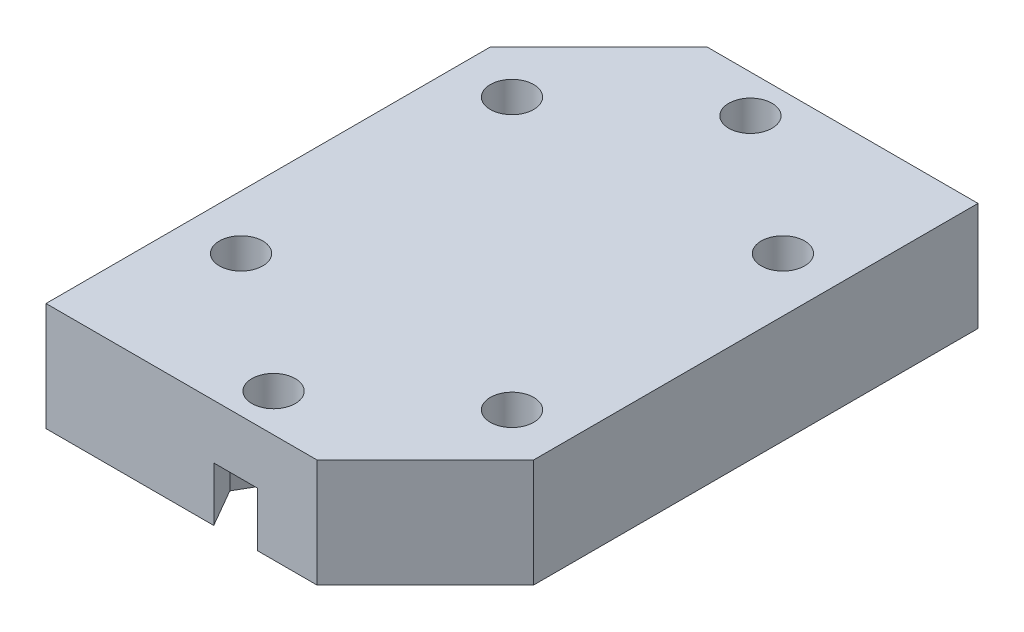
ISO-10303-21;
HEADER;
FILE_DESCRIPTION(('STEP AP214'),'2;1');
FILE_NAME('part.step','',(''),(''),'','','');
FILE_SCHEMA(('AUTOMOTIVE_DESIGN { 1 0 10303 214 1 1 1 1 }'));
ENDSEC;
DATA;
#1=APPLICATION_CONTEXT('core data for automotive mechanical design processes');
#2=APPLICATION_PROTOCOL_DEFINITION('international standard','automotive_design',2000,#1);
#3=PRODUCT_CONTEXT('',#1,'mechanical');
#4=PRODUCT('Part','Part','',(#3));
#5=PRODUCT_RELATED_PRODUCT_CATEGORY('part','',(#4));
#6=PRODUCT_DEFINITION_FORMATION('','',#4);
#7=PRODUCT_DEFINITION_CONTEXT('part definition',#1,'design');
#8=PRODUCT_DEFINITION('design','',#6,#7);
#9=PRODUCT_DEFINITION_SHAPE('','',#8);
#10=(LENGTH_UNIT() NAMED_UNIT(*) SI_UNIT(.MILLI.,.METRE.));
#11=(NAMED_UNIT(*) PLANE_ANGLE_UNIT() SI_UNIT($,.RADIAN.));
#12=(NAMED_UNIT(*) SI_UNIT($,.STERADIAN.) SOLID_ANGLE_UNIT());
#13=UNCERTAINTY_MEASURE_WITH_UNIT(LENGTH_MEASURE(1.E-05),#10,'distance_accuracy_value','');
#14=(GEOMETRIC_REPRESENTATION_CONTEXT(3) GLOBAL_UNCERTAINTY_ASSIGNED_CONTEXT((#13)) GLOBAL_UNIT_ASSIGNED_CONTEXT((#10,
#11,#12)) REPRESENTATION_CONTEXT('',''));
#15=CARTESIAN_POINT('',(0.,0.,0.));
#16=DIRECTION('',(0.,0.,1.));
#17=DIRECTION('',(1.,0.,0.));
#18=AXIS2_PLACEMENT_3D('',#15,#16,#17);
#19=CARTESIAN_POINT('',(0.,0.,0.));
#20=DIRECTION('',(0.,1.,0.));
#21=DIRECTION('',(0.,0.,1.));
#22=AXIS2_PLACEMENT_3D('',#19,#20,#21);
#23=PLANE('',#22);
#24=CARTESIAN_POINT('',(-12.5,0.,12.5));
#25=DIRECTION('',(0.,1.,0.));
#26=DIRECTION('',(0.,0.,-1.));
#27=AXIS2_PLACEMENT_3D('',#24,#25,#26);
#28=CIRCLE('',#27,2.);
#29=CARTESIAN_POINT('',(-12.5,0.,10.5));
#30=VERTEX_POINT('',#29);
#31=EDGE_CURVE('E219',#30,#30,#28,.T.);
#32=ORIENTED_EDGE('',*,*,#31,.T.);
#33=EDGE_LOOP('',(#32));
#34=FACE_BOUND('',#33,.T.);
#35=CARTESIAN_POINT('',(12.5,0.,-12.5));
#36=DIRECTION('',(0.,1.,0.));
#37=DIRECTION('',(0.,0.,-1.));
#38=AXIS2_PLACEMENT_3D('',#35,#36,#37);
#39=CIRCLE('',#38,2.);
#40=CARTESIAN_POINT('',(12.5,0.,-14.5));
#41=VERTEX_POINT('',#40);
#42=EDGE_CURVE('E229',#41,#41,#39,.T.);
#43=ORIENTED_EDGE('',*,*,#42,.T.);
#44=EDGE_LOOP('',(#43));
#45=FACE_BOUND('',#44,.T.);
#46=CARTESIAN_POINT('',(-12.5,0.,-12.5));
#47=DIRECTION('',(0.,1.,0.));
#48=DIRECTION('',(0.,0.,1.));
#49=AXIS2_PLACEMENT_3D('',#46,#47,#48);
#50=CIRCLE('',#49,2.);
#51=CARTESIAN_POINT('',(-12.5,0.,-10.5));
#52=VERTEX_POINT('',#51);
#53=EDGE_CURVE('E235',#52,#52,#50,.T.);
#54=ORIENTED_EDGE('',*,*,#53,.T.);
#55=EDGE_LOOP('',(#54));
#56=FACE_BOUND('',#55,.T.);
#57=CARTESIAN_POINT('',(12.5,0.,12.5));
#58=DIRECTION('',(0.,1.,0.));
#59=DIRECTION('',(0.,0.,1.));
#60=AXIS2_PLACEMENT_3D('',#57,#58,#59);
#61=CIRCLE('',#60,2.00000000000002);
#62=CARTESIAN_POINT('',(12.5,0.,14.5));
#63=VERTEX_POINT('',#62);
#64=EDGE_CURVE('E223',#63,#63,#61,.T.);
#65=ORIENTED_EDGE('',*,*,#64,.T.);
#66=EDGE_LOOP('',(#65));
#67=FACE_BOUND('',#66,.T.);
#68=DIRECTION('',(0.,0.,1.));
#69=VECTOR('',#68,1.);
#70=CARTESIAN_POINT('',(-17.5,0.,-25.5));
#71=LINE('',#70,#69);
#72=CARTESIAN_POINT('',(-17.5,0.,-15.5));
#73=VERTEX_POINT('',#72);
#74=CARTESIAN_POINT('',(-17.5,0.,25.5));
#75=VERTEX_POINT('',#74);
#76=EDGE_CURVE('E174',#73,#75,#71,.T.);
#77=ORIENTED_EDGE('',*,*,#76,.F.);
#78=DIRECTION('',(-0.707106781186548,0.,0.707106781186548));
#79=VECTOR('',#78,1.);
#80=CARTESIAN_POINT('',(-7.5,0.,-25.5));
#81=LINE('',#80,#79);
#82=CARTESIAN_POINT('',(-7.5,0.,-25.5));
#83=VERTEX_POINT('',#82);
#84=EDGE_CURVE('E50',#83,#73,#81,.T.);
#85=ORIENTED_EDGE('',*,*,#84,.F.);
#86=DIRECTION('',(-1.,0.,0.));
#87=VECTOR('',#86,1.);
#88=CARTESIAN_POINT('',(-17.5,0.,-25.5));
#89=LINE('',#88,#87);
#90=CARTESIAN_POINT('',(-2.02072594216369,0.,-25.5));
#91=VERTEX_POINT('',#90);
#92=EDGE_CURVE('E172',#91,#83,#89,.T.);
#93=ORIENTED_EDGE('',*,*,#92,.F.);
#94=DIRECTION('',(-0.5,0.,0.866025403784439));
#95=VECTOR('',#94,1.);
#96=CARTESIAN_POINT('',(-2.02072594216369,0.,-25.5));
#97=LINE('',#96,#95);
#98=CARTESIAN_POINT('',(-4.04145188432738,0.,-22.));
#99=VERTEX_POINT('',#98);
#100=EDGE_CURVE('E330',#91,#99,#97,.T.);
#101=ORIENTED_EDGE('',*,*,#100,.T.);
#102=DIRECTION('',(0.5,0.,0.866025403784439));
#103=VECTOR('',#102,1.);
#104=CARTESIAN_POINT('',(-4.04145188432738,0.,-22.));
#105=LINE('',#104,#103);
#106=CARTESIAN_POINT('',(-2.02072594216369,0.,-18.5));
#107=VERTEX_POINT('',#106);
#108=EDGE_CURVE('E332',#99,#107,#105,.T.);
#109=ORIENTED_EDGE('',*,*,#108,.T.);
#110=DIRECTION('',(1.,0.,0.));
#111=VECTOR('',#110,1.);
#112=CARTESIAN_POINT('',(-2.02072594216369,0.,-18.5));
#113=LINE('',#112,#111);
#114=CARTESIAN_POINT('',(2.02072594216369,0.,-18.5));
#115=VERTEX_POINT('',#114);
#116=EDGE_CURVE('E314',#107,#115,#113,.T.);
#117=ORIENTED_EDGE('',*,*,#116,.T.);
#118=DIRECTION('',(0.5,0.,-0.866025403784439));
#119=VECTOR('',#118,1.);
#120=CARTESIAN_POINT('',(2.02072594216369,0.,-18.5));
#121=LINE('',#120,#119);
#122=CARTESIAN_POINT('',(4.04145188432738,0.,-22.));
#123=VERTEX_POINT('',#122);
#124=EDGE_CURVE('E325',#115,#123,#121,.T.);
#125=ORIENTED_EDGE('',*,*,#124,.T.);
#126=DIRECTION('',(-0.5,0.,-0.866025403784439));
#127=VECTOR('',#126,1.);
#128=CARTESIAN_POINT('',(4.04145188432738,0.,-22.));
#129=LINE('',#128,#127);
#130=CARTESIAN_POINT('',(2.02072594216369,0.,-25.5));
#131=VERTEX_POINT('',#130);
#132=EDGE_CURVE('E327',#123,#131,#129,.T.);
#133=ORIENTED_EDGE('',*,*,#132,.T.);
#134=CARTESIAN_POINT('',(17.5,0.,-25.5));
#135=VERTEX_POINT('',#134);
#136=EDGE_CURVE('E181',#135,#131,#89,.T.);
#137=ORIENTED_EDGE('',*,*,#136,.F.);
#138=DIRECTION('',(0.,0.,-1.));
#139=VECTOR('',#138,1.);
#140=CARTESIAN_POINT('',(17.5,0.,-25.5));
#141=LINE('',#140,#139);
#142=CARTESIAN_POINT('',(17.5,0.,15.5));
#143=VERTEX_POINT('',#142);
#144=EDGE_CURVE('E182',#143,#135,#141,.T.);
#145=ORIENTED_EDGE('',*,*,#144,.F.);
#146=DIRECTION('',(-0.707106781186548,0.,0.707106781186548));
#147=VECTOR('',#146,1.);
#148=CARTESIAN_POINT('',(17.5,0.,15.5));
#149=LINE('',#148,#147);
#150=CARTESIAN_POINT('',(7.50000000000001,0.,25.5));
#151=VERTEX_POINT('',#150);
#152=EDGE_CURVE('E58',#143,#151,#149,.T.);
#153=ORIENTED_EDGE('',*,*,#152,.T.);
#154=DIRECTION('',(1.,0.,0.));
#155=VECTOR('',#154,1.);
#156=CARTESIAN_POINT('',(-17.5,0.,25.5));
#157=LINE('',#156,#155);
#158=CARTESIAN_POINT('',(2.02072594216373,0.,25.5));
#159=VERTEX_POINT('',#158);
#160=EDGE_CURVE('E190',#159,#151,#157,.T.);
#161=ORIENTED_EDGE('',*,*,#160,.F.);
#162=DIRECTION('',(0.499999999999995,0.,-0.866025403784441));
#163=VECTOR('',#162,1.);
#164=CARTESIAN_POINT('',(2.02072594216373,0.,25.5));
#165=LINE('',#164,#163);
#166=CARTESIAN_POINT('',(4.04145188432738,0.,22.));
#167=VERTEX_POINT('',#166);
#168=EDGE_CURVE('E265',#159,#167,#165,.T.);
#169=ORIENTED_EDGE('',*,*,#168,.T.);
#170=DIRECTION('',(-0.500000000000001,0.,-0.866025403784438));
#171=VECTOR('',#170,1.);
#172=CARTESIAN_POINT('',(4.04145188432738,0.,22.));
#173=LINE('',#172,#171);
#174=CARTESIAN_POINT('',(2.02072594216368,0.,18.5));
#175=VERTEX_POINT('',#174);
#176=EDGE_CURVE('E288',#167,#175,#173,.T.);
#177=ORIENTED_EDGE('',*,*,#176,.T.);
#178=DIRECTION('',(-1.,0.,0.));
#179=VECTOR('',#178,1.);
#180=CARTESIAN_POINT('',(2.02072594216368,0.,18.5));
#181=LINE('',#180,#179);
#182=CARTESIAN_POINT('',(-2.02072594216371,0.,18.5));
#183=VERTEX_POINT('',#182);
#184=EDGE_CURVE('E291',#175,#183,#181,.T.);
#185=ORIENTED_EDGE('',*,*,#184,.T.);
#186=DIRECTION('',(-0.499999999999995,0.,0.866025403784441));
#187=VECTOR('',#186,1.);
#188=CARTESIAN_POINT('',(-2.02072594216371,0.,18.5));
#189=LINE('',#188,#187);
#190=CARTESIAN_POINT('',(-4.04145188432738,0.,22.));
#191=VERTEX_POINT('',#190);
#192=EDGE_CURVE('E294',#183,#191,#189,.T.);
#193=ORIENTED_EDGE('',*,*,#192,.T.);
#194=DIRECTION('',(0.500000000000007,0.,0.866025403784434));
#195=VECTOR('',#194,1.);
#196=CARTESIAN_POINT('',(-4.04145188432738,0.,22.));
#197=LINE('',#196,#195);
#198=CARTESIAN_POINT('',(-2.02072594216366,0.,25.5));
#199=VERTEX_POINT('',#198);
#200=EDGE_CURVE('E274',#191,#199,#197,.T.);
#201=ORIENTED_EDGE('',*,*,#200,.T.);
#202=EDGE_CURVE('E191',#75,#199,#157,.T.);
#203=ORIENTED_EDGE('',*,*,#202,.F.);
#204=EDGE_LOOP('',(#77,#85,#93,#101,#109,#117,#125,#133,#137,#145,#153,#161,#169,#177,#185,#193,
#201,#203));
#205=FACE_BOUND('',#204,.T.);
#206=ADVANCED_FACE('F33',(#34,#45,#56,#67,#205),#23,.F.);
#207=CARTESIAN_POINT('',(-17.5,10.,25.5));
#208=DIRECTION('',(0.,0.,-1.));
#209=DIRECTION('',(-1.,0.,0.));
#210=AXIS2_PLACEMENT_3D('',#207,#208,#209);
#211=PLANE('',#210);
#212=DIRECTION('',(0.,-1.,0.));
#213=VECTOR('',#212,1.);
#214=CARTESIAN_POINT('',(7.50000000000001,10.,25.5));
#215=LINE('',#214,#213);
#216=CARTESIAN_POINT('',(7.50000000000001,10.,25.5));
#217=VERTEX_POINT('',#216);
#218=EDGE_CURVE('E260',#217,#151,#215,.T.);
#219=ORIENTED_EDGE('',*,*,#218,.F.);
#220=DIRECTION('',(1.,0.,0.));
#221=VECTOR('',#220,1.);
#222=CARTESIAN_POINT('',(-17.5,10.,25.5));
#223=LINE('',#222,#221);
#224=CARTESIAN_POINT('',(-17.5,10.,25.5));
#225=VERTEX_POINT('',#224);
#226=EDGE_CURVE('E196',#225,#217,#223,.T.);
#227=ORIENTED_EDGE('',*,*,#226,.F.);
#228=DIRECTION('',(0.,-1.,0.));
#229=VECTOR('',#228,1.);
#230=CARTESIAN_POINT('',(-17.5,10.,25.5));
#231=LINE('',#230,#229);
#232=EDGE_CURVE('E42',#225,#75,#231,.T.);
#233=ORIENTED_EDGE('',*,*,#232,.T.);
#234=ORIENTED_EDGE('',*,*,#202,.T.);
#235=DIRECTION('',(0.,-1.,0.));
#236=VECTOR('',#235,1.);
#237=CARTESIAN_POINT('',(-2.02072594216366,5.,25.5));
#238=LINE('',#237,#236);
#239=CARTESIAN_POINT('',(-2.02072594216366,5.,25.5));
#240=VERTEX_POINT('',#239);
#241=EDGE_CURVE('E300',#240,#199,#238,.T.);
#242=ORIENTED_EDGE('',*,*,#241,.F.);
#243=DIRECTION('',(1.,0.,0.));
#244=VECTOR('',#243,1.);
#245=CARTESIAN_POINT('',(-2.02072594216366,5.,25.5));
#246=LINE('',#245,#244);
#247=CARTESIAN_POINT('',(2.02072594216372,5.,25.5));
#248=VERTEX_POINT('',#247);
#249=EDGE_CURVE('E282',#240,#248,#246,.T.);
#250=ORIENTED_EDGE('',*,*,#249,.T.);
#251=DIRECTION('',(0.,-1.,0.));
#252=VECTOR('',#251,1.);
#253=CARTESIAN_POINT('',(2.02072594216373,5.,25.5));
#254=LINE('',#253,#252);
#255=EDGE_CURVE('E285',#248,#159,#254,.T.);
#256=ORIENTED_EDGE('',*,*,#255,.T.);
#257=ORIENTED_EDGE('',*,*,#160,.T.);
#258=EDGE_LOOP('',(#219,#227,#233,#234,#242,#250,#256,#257));
#259=FACE_BOUND('',#258,.T.);
#260=ADVANCED_FACE('F258',(#259),#211,.F.);
#261=CARTESIAN_POINT('',(0.,10.,0.));
#262=DIRECTION('',(0.,1.,0.));
#263=DIRECTION('',(0.,0.,1.));
#264=AXIS2_PLACEMENT_3D('',#261,#262,#263);
#265=PLANE('',#264);
#266=DIRECTION('',(-0.707106781186548,0.,0.707106781186548));
#267=VECTOR('',#266,1.);
#268=CARTESIAN_POINT('',(-7.5,10.,-25.5));
#269=LINE('',#268,#267);
#270=CARTESIAN_POINT('',(-7.5,10.,-25.5));
#271=VERTEX_POINT('',#270);
#272=CARTESIAN_POINT('',(-17.5,10.,-15.5));
#273=VERTEX_POINT('',#272);
#274=EDGE_CURVE('E161',#271,#273,#269,.T.);
#275=ORIENTED_EDGE('',*,*,#274,.T.);
#276=DIRECTION('',(0.,0.,1.));
#277=VECTOR('',#276,1.);
#278=CARTESIAN_POINT('',(-17.5,10.,-25.5));
#279=LINE('',#278,#277);
#280=EDGE_CURVE('E245',#273,#225,#279,.T.);
#281=ORIENTED_EDGE('',*,*,#280,.T.);
#282=ORIENTED_EDGE('',*,*,#226,.T.);
#283=DIRECTION('',(-0.707106781186548,0.,0.707106781186548));
#284=VECTOR('',#283,1.);
#285=CARTESIAN_POINT('',(17.5,10.,15.5));
#286=LINE('',#285,#284);
#287=CARTESIAN_POINT('',(17.5,10.,15.5));
#288=VERTEX_POINT('',#287);
#289=EDGE_CURVE('E252',#288,#217,#286,.T.);
#290=ORIENTED_EDGE('',*,*,#289,.F.);
#291=DIRECTION('',(0.,0.,-1.));
#292=VECTOR('',#291,1.);
#293=CARTESIAN_POINT('',(17.5,10.,-25.5));
#294=LINE('',#293,#292);
#295=CARTESIAN_POINT('',(17.5,10.,-25.5));
#296=VERTEX_POINT('',#295);
#297=EDGE_CURVE('E194',#288,#296,#294,.T.);
#298=ORIENTED_EDGE('',*,*,#297,.T.);
#299=DIRECTION('',(-1.,0.,0.));
#300=VECTOR('',#299,1.);
#301=CARTESIAN_POINT('',(-17.5,10.,-25.5));
#302=LINE('',#301,#300);
#303=EDGE_CURVE('E243',#296,#271,#302,.T.);
#304=ORIENTED_EDGE('',*,*,#303,.T.);
#305=EDGE_LOOP('',(#275,#281,#282,#290,#298,#304));
#306=FACE_BOUND('',#305,.T.);
#307=CARTESIAN_POINT('',(0.,10.,22.));
#308=DIRECTION('',(0.,1.,0.));
#309=DIRECTION('',(0.,0.,-1.));
#310=AXIS2_PLACEMENT_3D('',#307,#308,#309);
#311=CIRCLE('',#310,2.);
#312=CARTESIAN_POINT('',(0.,10.,20.));
#313=VERTEX_POINT('',#312);
#314=EDGE_CURVE('E199',#313,#313,#311,.T.);
#315=ORIENTED_EDGE('',*,*,#314,.F.);
#316=EDGE_LOOP('',(#315));
#317=FACE_BOUND('',#316,.T.);
#318=CARTESIAN_POINT('',(-12.5,10.,12.5));
#319=DIRECTION('',(0.,1.,0.));
#320=DIRECTION('',(0.,0.,-1.));
#321=AXIS2_PLACEMENT_3D('',#318,#319,#320);
#322=CIRCLE('',#321,2.);
#323=CARTESIAN_POINT('',(-12.5,10.,10.5));
#324=VERTEX_POINT('',#323);
#325=EDGE_CURVE('E220',#324,#324,#322,.T.);
#326=ORIENTED_EDGE('',*,*,#325,.F.);
#327=EDGE_LOOP('',(#326));
#328=FACE_BOUND('',#327,.T.);
#329=CARTESIAN_POINT('',(12.5,10.,-12.5));
#330=DIRECTION('',(0.,1.,0.));
#331=DIRECTION('',(0.,0.,-1.));
#332=AXIS2_PLACEMENT_3D('',#329,#330,#331);
#333=CIRCLE('',#332,2.);
#334=CARTESIAN_POINT('',(12.5,10.,-14.5));
#335=VERTEX_POINT('',#334);
#336=EDGE_CURVE('E232',#335,#335,#333,.T.);
#337=ORIENTED_EDGE('',*,*,#336,.F.);
#338=EDGE_LOOP('',(#337));
#339=FACE_BOUND('',#338,.T.);
#340=CARTESIAN_POINT('',(-12.5,10.,-12.5));
#341=DIRECTION('',(0.,1.,0.));
#342=DIRECTION('',(0.,0.,1.));
#343=AXIS2_PLACEMENT_3D('',#340,#341,#342);
#344=CIRCLE('',#343,2.);
#345=CARTESIAN_POINT('',(-12.5,10.,-10.5));
#346=VERTEX_POINT('',#345);
#347=EDGE_CURVE('E185',#346,#346,#344,.T.);
#348=ORIENTED_EDGE('',*,*,#347,.F.);
#349=EDGE_LOOP('',(#348));
#350=FACE_BOUND('',#349,.T.);
#351=CARTESIAN_POINT('',(12.5,10.,12.5));
#352=DIRECTION('',(0.,1.,0.));
#353=DIRECTION('',(0.,0.,1.));
#354=AXIS2_PLACEMENT_3D('',#351,#352,#353);
#355=CIRCLE('',#354,2.00000000000002);
#356=CARTESIAN_POINT('',(12.5,10.,14.5));
#357=VERTEX_POINT('',#356);
#358=EDGE_CURVE('E226',#357,#357,#355,.T.);
#359=ORIENTED_EDGE('',*,*,#358,.F.);
#360=EDGE_LOOP('',(#359));
#361=FACE_BOUND('',#360,.T.);
#362=CARTESIAN_POINT('',(0.,10.,-22.));
#363=DIRECTION('',(0.,1.,0.));
#364=DIRECTION('',(0.,0.,1.));
#365=AXIS2_PLACEMENT_3D('',#362,#363,#364);
#366=CIRCLE('',#365,2.);
#367=CARTESIAN_POINT('',(0.,10.,-20.));
#368=VERTEX_POINT('',#367);
#369=EDGE_CURVE('E204',#368,#368,#366,.T.);
#370=ORIENTED_EDGE('',*,*,#369,.F.);
#371=EDGE_LOOP('',(#370));
#372=FACE_BOUND('',#371,.T.);
#373=ADVANCED_FACE('F250',(#306,#317,#328,#339,#350,#361,#372),#265,.T.);
#374=CARTESIAN_POINT('',(17.5,10.,-25.5));
#375=DIRECTION('',(-1.,0.,0.));
#376=DIRECTION('',(0.,0.,1.));
#377=AXIS2_PLACEMENT_3D('',#374,#375,#376);
#378=PLANE('',#377);
#379=DIRECTION('',(0.,-1.,0.));
#380=VECTOR('',#379,1.);
#381=CARTESIAN_POINT('',(17.5,10.,15.5));
#382=LINE('',#381,#380);
#383=EDGE_CURVE('E263',#288,#143,#382,.T.);
#384=ORIENTED_EDGE('',*,*,#383,.T.);
#385=ORIENTED_EDGE('',*,*,#144,.T.);
#386=DIRECTION('',(0.,-1.,0.));
#387=VECTOR('',#386,1.);
#388=CARTESIAN_POINT('',(17.5,10.,-25.5));
#389=LINE('',#388,#387);
#390=EDGE_CURVE('E11',#296,#135,#389,.T.);
#391=ORIENTED_EDGE('',*,*,#390,.F.);
#392=ORIENTED_EDGE('',*,*,#297,.F.);
#393=EDGE_LOOP('',(#384,#385,#391,#392));
#394=FACE_BOUND('',#393,.T.);
#395=ADVANCED_FACE('F35',(#394),#378,.F.);
#396=CARTESIAN_POINT('',(-17.5,10.,-25.5));
#397=DIRECTION('',(0.,0.,1.));
#398=DIRECTION('',(1.,0.,0.));
#399=AXIS2_PLACEMENT_3D('',#396,#397,#398);
#400=PLANE('',#399);
#401=ORIENTED_EDGE('',*,*,#92,.T.);
#402=DIRECTION('',(0.,-1.,0.));
#403=VECTOR('',#402,1.);
#404=CARTESIAN_POINT('',(-7.5,10.,-25.5));
#405=LINE('',#404,#403);
#406=EDGE_CURVE('E158',#271,#83,#405,.T.);
#407=ORIENTED_EDGE('',*,*,#406,.F.);
#408=ORIENTED_EDGE('',*,*,#303,.F.);
#409=ORIENTED_EDGE('',*,*,#390,.T.);
#410=ORIENTED_EDGE('',*,*,#136,.T.);
#411=DIRECTION('',(0.,-1.,0.));
#412=VECTOR('',#411,1.);
#413=CARTESIAN_POINT('',(2.02072594216369,5.,-25.5));
#414=LINE('',#413,#412);
#415=CARTESIAN_POINT('',(2.02072594216369,5.,-25.5));
#416=VERTEX_POINT('',#415);
#417=EDGE_CURVE('E207',#416,#131,#414,.T.);
#418=ORIENTED_EDGE('',*,*,#417,.F.);
#419=DIRECTION('',(-1.,0.,0.));
#420=VECTOR('',#419,1.);
#421=CARTESIAN_POINT('',(2.02072594216369,5.,-25.5));
#422=LINE('',#421,#420);
#423=CARTESIAN_POINT('',(-2.02072594216369,5.,-25.5));
#424=VERTEX_POINT('',#423);
#425=EDGE_CURVE('E316',#416,#424,#422,.T.);
#426=ORIENTED_EDGE('',*,*,#425,.T.);
#427=DIRECTION('',(0.,-1.,0.));
#428=VECTOR('',#427,1.);
#429=CARTESIAN_POINT('',(-2.02072594216369,5.,-25.5));
#430=LINE('',#429,#428);
#431=EDGE_CURVE('E180',#424,#91,#430,.T.);
#432=ORIENTED_EDGE('',*,*,#431,.T.);
#433=EDGE_LOOP('',(#401,#407,#408,#409,#410,#418,#426,#432));
#434=FACE_BOUND('',#433,.T.);
#435=ADVANCED_FACE('F177',(#434),#400,.F.);
#436=CARTESIAN_POINT('',(-17.5,10.,-25.5));
#437=DIRECTION('',(1.,0.,0.));
#438=DIRECTION('',(0.,0.,-1.));
#439=AXIS2_PLACEMENT_3D('',#436,#437,#438);
#440=PLANE('',#439);
#441=ORIENTED_EDGE('',*,*,#280,.F.);
#442=DIRECTION('',(0.,-1.,0.));
#443=VECTOR('',#442,1.);
#444=CARTESIAN_POINT('',(-17.5,10.,-15.5));
#445=LINE('',#444,#443);
#446=EDGE_CURVE('E166',#273,#73,#445,.T.);
#447=ORIENTED_EDGE('',*,*,#446,.T.);
#448=ORIENTED_EDGE('',*,*,#76,.T.);
#449=ORIENTED_EDGE('',*,*,#232,.F.);
#450=EDGE_LOOP('',(#441,#447,#448,#449));
#451=FACE_BOUND('',#450,.T.);
#452=ADVANCED_FACE('F380',(#451),#440,.F.);
#453=CARTESIAN_POINT('',(-12.5,10.,-12.5));
#454=DIRECTION('',(0.,-1.,0.));
#455=DIRECTION('',(0.,0.,-1.));
#456=AXIS2_PLACEMENT_3D('',#453,#454,#455);
#457=CYLINDRICAL_SURFACE('',#456,2.);
#458=ORIENTED_EDGE('',*,*,#347,.T.);
#459=EDGE_LOOP('',(#458));
#460=FACE_BOUND('',#459,.T.);
#461=ORIENTED_EDGE('',*,*,#53,.F.);
#462=EDGE_LOOP('',(#461));
#463=FACE_BOUND('',#462,.T.);
#464=ADVANCED_FACE('F382',(#460,#463),#457,.F.);
#465=CARTESIAN_POINT('',(12.5,10.,-12.5));
#466=DIRECTION('',(0.,-1.,0.));
#467=DIRECTION('',(0.,0.,-1.));
#468=AXIS2_PLACEMENT_3D('',#465,#466,#467);
#469=CYLINDRICAL_SURFACE('',#468,2.);
#470=ORIENTED_EDGE('',*,*,#336,.T.);
#471=EDGE_LOOP('',(#470));
#472=FACE_BOUND('',#471,.T.);
#473=ORIENTED_EDGE('',*,*,#42,.F.);
#474=EDGE_LOOP('',(#473));
#475=FACE_BOUND('',#474,.T.);
#476=ADVANCED_FACE('F545',(#472,#475),#469,.F.);
#477=CARTESIAN_POINT('',(12.5,10.,12.5));
#478=DIRECTION('',(0.,-1.,0.));
#479=DIRECTION('',(0.,0.,-1.));
#480=AXIS2_PLACEMENT_3D('',#477,#478,#479);
#481=CYLINDRICAL_SURFACE('',#480,2.00000000000002);
#482=ORIENTED_EDGE('',*,*,#358,.T.);
#483=EDGE_LOOP('',(#482));
#484=FACE_BOUND('',#483,.T.);
#485=ORIENTED_EDGE('',*,*,#64,.F.);
#486=EDGE_LOOP('',(#485));
#487=FACE_BOUND('',#486,.T.);
#488=ADVANCED_FACE('F551',(#484,#487),#481,.F.);
#489=CARTESIAN_POINT('',(-12.5,10.,12.5));
#490=DIRECTION('',(0.,-1.,0.));
#491=DIRECTION('',(0.,0.,-1.));
#492=AXIS2_PLACEMENT_3D('',#489,#490,#491);
#493=CYLINDRICAL_SURFACE('',#492,2.);
#494=ORIENTED_EDGE('',*,*,#325,.T.);
#495=EDGE_LOOP('',(#494));
#496=FACE_BOUND('',#495,.T.);
#497=ORIENTED_EDGE('',*,*,#31,.F.);
#498=EDGE_LOOP('',(#497));
#499=FACE_BOUND('',#498,.T.);
#500=ADVANCED_FACE('F559',(#496,#499),#493,.F.);
#501=CARTESIAN_POINT('',(0.,10.,-22.));
#502=DIRECTION('',(0.,-1.,0.));
#503=DIRECTION('',(0.,0.,-1.));
#504=AXIS2_PLACEMENT_3D('',#501,#502,#503);
#505=CYLINDRICAL_SURFACE('',#504,2.);
#506=CARTESIAN_POINT('',(0.,5.,-22.));
#507=DIRECTION('',(0.,1.,0.));
#508=DIRECTION('',(0.,0.,1.));
#509=AXIS2_PLACEMENT_3D('',#506,#507,#508);
#510=CIRCLE('',#509,2.);
#511=CARTESIAN_POINT('',(0.,5.,-20.));
#512=VERTEX_POINT('',#511);
#513=EDGE_CURVE('E197',#512,#512,#510,.T.);
#514=ORIENTED_EDGE('',*,*,#513,.F.);
#515=EDGE_LOOP('',(#514));
#516=FACE_BOUND('',#515,.T.);
#517=ORIENTED_EDGE('',*,*,#369,.T.);
#518=EDGE_LOOP('',(#517));
#519=FACE_BOUND('',#518,.T.);
#520=ADVANCED_FACE('F366',(#516,#519),#505,.F.);
#521=CARTESIAN_POINT('',(0.,10.,22.));
#522=DIRECTION('',(0.,-1.,0.));
#523=DIRECTION('',(0.,0.,-1.));
#524=AXIS2_PLACEMENT_3D('',#521,#522,#523);
#525=CYLINDRICAL_SURFACE('',#524,2.);
#526=CARTESIAN_POINT('',(0.,5.,22.));
#527=DIRECTION('',(0.,1.,0.));
#528=DIRECTION('',(0.,0.,1.));
#529=AXIS2_PLACEMENT_3D('',#526,#527,#528);
#530=CIRCLE('',#529,2.);
#531=CARTESIAN_POINT('',(0.,5.,24.));
#532=VERTEX_POINT('',#531);
#533=EDGE_CURVE('E37',#532,#532,#530,.T.);
#534=ORIENTED_EDGE('',*,*,#533,.F.);
#535=EDGE_LOOP('',(#534));
#536=FACE_BOUND('',#535,.T.);
#537=ORIENTED_EDGE('',*,*,#314,.T.);
#538=EDGE_LOOP('',(#537));
#539=FACE_BOUND('',#538,.T.);
#540=ADVANCED_FACE('F358',(#536,#539),#525,.F.);
#541=CARTESIAN_POINT('',(2.02072594216369,5.,-18.5));
#542=DIRECTION('',(-0.866025403784439,0.,-0.5));
#543=DIRECTION('',(-0.5,0.,0.866025403784439));
#544=AXIS2_PLACEMENT_3D('',#541,#542,#543);
#545=PLANE('',#544);
#546=ORIENTED_EDGE('',*,*,#124,.F.);
#547=DIRECTION('',(0.,-1.,0.));
#548=VECTOR('',#547,1.);
#549=CARTESIAN_POINT('',(2.02072594216369,5.,-18.5));
#550=LINE('',#549,#548);
#551=CARTESIAN_POINT('',(2.02072594216369,5.,-18.5));
#552=VERTEX_POINT('',#551);
#553=EDGE_CURVE('E324',#552,#115,#550,.T.);
#554=ORIENTED_EDGE('',*,*,#553,.F.);
#555=DIRECTION('',(0.5,0.,-0.866025403784439));
#556=VECTOR('',#555,1.);
#557=CARTESIAN_POINT('',(2.02072594216369,5.,-18.5));
#558=LINE('',#557,#556);
#559=CARTESIAN_POINT('',(4.04145188432738,5.,-22.));
#560=VERTEX_POINT('',#559);
#561=EDGE_CURVE('E311',#552,#560,#558,.T.);
#562=ORIENTED_EDGE('',*,*,#561,.T.);
#563=DIRECTION('',(0.,-1.,0.));
#564=VECTOR('',#563,1.);
#565=CARTESIAN_POINT('',(4.04145188432738,5.,-22.));
#566=LINE('',#565,#564);
#567=EDGE_CURVE('E200',#560,#123,#566,.T.);
#568=ORIENTED_EDGE('',*,*,#567,.T.);
#569=EDGE_LOOP('',(#546,#554,#562,#568));
#570=FACE_BOUND('',#569,.T.);
#571=ADVANCED_FACE('F355',(#570),#545,.T.);
#572=CARTESIAN_POINT('',(4.04145188432738,5.,-22.));
#573=DIRECTION('',(-0.866025403784439,0.,0.5));
#574=DIRECTION('',(0.5,0.,0.866025403784439));
#575=AXIS2_PLACEMENT_3D('',#572,#573,#574);
#576=PLANE('',#575);
#577=ORIENTED_EDGE('',*,*,#132,.F.);
#578=ORIENTED_EDGE('',*,*,#567,.F.);
#579=DIRECTION('',(-0.5,0.,-0.866025403784439));
#580=VECTOR('',#579,1.);
#581=CARTESIAN_POINT('',(4.04145188432738,5.,-22.));
#582=LINE('',#581,#580);
#583=EDGE_CURVE('E313',#560,#416,#582,.T.);
#584=ORIENTED_EDGE('',*,*,#583,.T.);
#585=ORIENTED_EDGE('',*,*,#417,.T.);
#586=EDGE_LOOP('',(#577,#578,#584,#585));
#587=FACE_BOUND('',#586,.T.);
#588=ADVANCED_FACE('F357',(#587),#576,.T.);
#589=CARTESIAN_POINT('',(-2.02072594216369,5.,-25.5));
#590=DIRECTION('',(0.866025403784439,0.,0.5));
#591=DIRECTION('',(0.5,0.,-0.866025403784439));
#592=AXIS2_PLACEMENT_3D('',#589,#590,#591);
#593=PLANE('',#592);
#594=ORIENTED_EDGE('',*,*,#100,.F.);
#595=ORIENTED_EDGE('',*,*,#431,.F.);
#596=DIRECTION('',(-0.5,0.,0.866025403784439));
#597=VECTOR('',#596,1.);
#598=CARTESIAN_POINT('',(-2.02072594216369,5.,-25.5));
#599=LINE('',#598,#597);
#600=CARTESIAN_POINT('',(-4.04145188432738,5.,-22.));
#601=VERTEX_POINT('',#600);
#602=EDGE_CURVE('E318',#424,#601,#599,.T.);
#603=ORIENTED_EDGE('',*,*,#602,.T.);
#604=DIRECTION('',(0.,-1.,0.));
#605=VECTOR('',#604,1.);
#606=CARTESIAN_POINT('',(-4.04145188432738,5.,-22.));
#607=LINE('',#606,#605);
#608=EDGE_CURVE('E340',#601,#99,#607,.T.);
#609=ORIENTED_EDGE('',*,*,#608,.T.);
#610=EDGE_LOOP('',(#594,#595,#603,#609));
#611=FACE_BOUND('',#610,.T.);
#612=ADVANCED_FACE('F344',(#611),#593,.T.);
#613=CARTESIAN_POINT('',(-4.04145188432738,5.,-22.));
#614=DIRECTION('',(0.866025403784439,0.,-0.5));
#615=DIRECTION('',(-0.5,0.,-0.866025403784439));
#616=AXIS2_PLACEMENT_3D('',#613,#614,#615);
#617=PLANE('',#616);
#618=ORIENTED_EDGE('',*,*,#108,.F.);
#619=ORIENTED_EDGE('',*,*,#608,.F.);
#620=DIRECTION('',(0.5,0.,0.866025403784439));
#621=VECTOR('',#620,1.);
#622=CARTESIAN_POINT('',(-4.04145188432738,5.,-22.));
#623=LINE('',#622,#621);
#624=CARTESIAN_POINT('',(-2.02072594216369,5.,-18.5));
#625=VERTEX_POINT('',#624);
#626=EDGE_CURVE('E320',#601,#625,#623,.T.);
#627=ORIENTED_EDGE('',*,*,#626,.T.);
#628=DIRECTION('',(0.,-1.,0.));
#629=VECTOR('',#628,1.);
#630=CARTESIAN_POINT('',(-2.02072594216369,5.,-18.5));
#631=LINE('',#630,#629);
#632=EDGE_CURVE('E338',#625,#107,#631,.T.);
#633=ORIENTED_EDGE('',*,*,#632,.T.);
#634=EDGE_LOOP('',(#618,#619,#627,#633));
#635=FACE_BOUND('',#634,.T.);
#636=ADVANCED_FACE('F347',(#635),#617,.T.);
#637=CARTESIAN_POINT('',(-2.02072594216369,5.,-18.5));
#638=DIRECTION('',(0.,0.,-1.));
#639=DIRECTION('',(-1.,0.,0.));
#640=AXIS2_PLACEMENT_3D('',#637,#638,#639);
#641=PLANE('',#640);
#642=ORIENTED_EDGE('',*,*,#116,.F.);
#643=ORIENTED_EDGE('',*,*,#632,.F.);
#644=DIRECTION('',(1.,0.,0.));
#645=VECTOR('',#644,1.);
#646=CARTESIAN_POINT('',(-2.02072594216369,5.,-18.5));
#647=LINE('',#646,#645);
#648=EDGE_CURVE('E322',#625,#552,#647,.T.);
#649=ORIENTED_EDGE('',*,*,#648,.T.);
#650=ORIENTED_EDGE('',*,*,#553,.T.);
#651=EDGE_LOOP('',(#642,#643,#649,#650));
#652=FACE_BOUND('',#651,.T.);
#653=ADVANCED_FACE('F351',(#652),#641,.T.);
#654=CARTESIAN_POINT('',(0.,5.,0.));
#655=DIRECTION('',(0.,1.,0.));
#656=DIRECTION('',(0.,0.,1.));
#657=AXIS2_PLACEMENT_3D('',#654,#655,#656);
#658=PLANE('',#657);
#659=ORIENTED_EDGE('',*,*,#513,.T.);
#660=EDGE_LOOP('',(#659));
#661=FACE_BOUND('',#660,.T.);
#662=ORIENTED_EDGE('',*,*,#561,.F.);
#663=ORIENTED_EDGE('',*,*,#648,.F.);
#664=ORIENTED_EDGE('',*,*,#626,.F.);
#665=ORIENTED_EDGE('',*,*,#602,.F.);
#666=ORIENTED_EDGE('',*,*,#425,.F.);
#667=ORIENTED_EDGE('',*,*,#583,.F.);
#668=EDGE_LOOP('',(#662,#663,#664,#665,#666,#667));
#669=FACE_BOUND('',#668,.T.);
#670=ADVANCED_FACE('F400',(#661,#669),#658,.F.);
#671=CARTESIAN_POINT('',(2.02072594216373,5.,25.5));
#672=DIRECTION('',(-0.866025403784442,0.,-0.499999999999995));
#673=DIRECTION('',(-0.499999999999995,0.,0.866025403784442));
#674=AXIS2_PLACEMENT_3D('',#671,#672,#673);
#675=PLANE('',#674);
#676=ORIENTED_EDGE('',*,*,#168,.F.);
#677=ORIENTED_EDGE('',*,*,#255,.F.);
#678=DIRECTION('',(0.499999999999995,0.,-0.866025403784441));
#679=VECTOR('',#678,1.);
#680=CARTESIAN_POINT('',(2.02072594216373,5.,25.5));
#681=LINE('',#680,#679);
#682=CARTESIAN_POINT('',(4.04145188432738,5.,22.));
#683=VERTEX_POINT('',#682);
#684=EDGE_CURVE('E270',#248,#683,#681,.T.);
#685=ORIENTED_EDGE('',*,*,#684,.T.);
#686=DIRECTION('',(0.,-1.,0.));
#687=VECTOR('',#686,1.);
#688=CARTESIAN_POINT('',(4.04145188432738,5.,22.));
#689=LINE('',#688,#687);
#690=EDGE_CURVE('E308',#683,#167,#689,.T.);
#691=ORIENTED_EDGE('',*,*,#690,.T.);
#692=EDGE_LOOP('',(#676,#677,#685,#691));
#693=FACE_BOUND('',#692,.T.);
#694=ADVANCED_FACE('F402',(#693),#675,.T.);
#695=CARTESIAN_POINT('',(4.04145188432738,5.,22.));
#696=DIRECTION('',(-0.866025403784438,0.,0.500000000000001));
#697=DIRECTION('',(0.500000000000001,0.,0.866025403784438));
#698=AXIS2_PLACEMENT_3D('',#695,#696,#697);
#699=PLANE('',#698);
#700=ORIENTED_EDGE('',*,*,#176,.F.);
#701=ORIENTED_EDGE('',*,*,#690,.F.);
#702=DIRECTION('',(-0.500000000000001,0.,-0.866025403784438));
#703=VECTOR('',#702,1.);
#704=CARTESIAN_POINT('',(4.04145188432738,5.,22.));
#705=LINE('',#704,#703);
#706=CARTESIAN_POINT('',(2.02072594216368,5.,18.5));
#707=VERTEX_POINT('',#706);
#708=EDGE_CURVE('E273',#683,#707,#705,.T.);
#709=ORIENTED_EDGE('',*,*,#708,.T.);
#710=DIRECTION('',(0.,-1.,0.));
#711=VECTOR('',#710,1.);
#712=CARTESIAN_POINT('',(2.02072594216368,5.,18.5));
#713=LINE('',#712,#711);
#714=EDGE_CURVE('E306',#707,#175,#713,.T.);
#715=ORIENTED_EDGE('',*,*,#714,.T.);
#716=EDGE_LOOP('',(#700,#701,#709,#715));
#717=FACE_BOUND('',#716,.T.);
#718=ADVANCED_FACE('F408',(#717),#699,.T.);
#719=CARTESIAN_POINT('',(2.02072594216368,5.,18.5));
#720=DIRECTION('',(0.,0.,1.));
#721=DIRECTION('',(1.,0.,0.));
#722=AXIS2_PLACEMENT_3D('',#719,#720,#721);
#723=PLANE('',#722);
#724=ORIENTED_EDGE('',*,*,#184,.F.);
#725=ORIENTED_EDGE('',*,*,#714,.F.);
#726=DIRECTION('',(-1.,0.,0.));
#727=VECTOR('',#726,1.);
#728=CARTESIAN_POINT('',(2.02072594216368,5.,18.5));
#729=LINE('',#728,#727);
#730=CARTESIAN_POINT('',(-2.02072594216371,5.,18.5));
#731=VERTEX_POINT('',#730);
#732=EDGE_CURVE('E276',#707,#731,#729,.T.);
#733=ORIENTED_EDGE('',*,*,#732,.T.);
#734=DIRECTION('',(0.,-1.,0.));
#735=VECTOR('',#734,1.);
#736=CARTESIAN_POINT('',(-2.02072594216371,5.,18.5));
#737=LINE('',#736,#735);
#738=EDGE_CURVE('E304',#731,#183,#737,.T.);
#739=ORIENTED_EDGE('',*,*,#738,.T.);
#740=EDGE_LOOP('',(#724,#725,#733,#739));
#741=FACE_BOUND('',#740,.T.);
#742=ADVANCED_FACE('F448',(#741),#723,.T.);
#743=CARTESIAN_POINT('',(-2.02072594216371,5.,18.5));
#744=DIRECTION('',(0.866025403784441,0.,0.499999999999995));
#745=DIRECTION('',(0.499999999999995,0.,-0.866025403784442));
#746=AXIS2_PLACEMENT_3D('',#743,#744,#745);
#747=PLANE('',#746);
#748=ORIENTED_EDGE('',*,*,#192,.F.);
#749=ORIENTED_EDGE('',*,*,#738,.F.);
#750=DIRECTION('',(-0.499999999999995,0.,0.866025403784441));
#751=VECTOR('',#750,1.);
#752=CARTESIAN_POINT('',(-2.02072594216371,5.,18.5));
#753=LINE('',#752,#751);
#754=CARTESIAN_POINT('',(-4.04145188432738,5.,22.));
#755=VERTEX_POINT('',#754);
#756=EDGE_CURVE('E278',#731,#755,#753,.T.);
#757=ORIENTED_EDGE('',*,*,#756,.T.);
#758=DIRECTION('',(0.,-1.,0.));
#759=VECTOR('',#758,1.);
#760=CARTESIAN_POINT('',(-4.04145188432738,5.,22.));
#761=LINE('',#760,#759);
#762=EDGE_CURVE('E302',#755,#191,#761,.T.);
#763=ORIENTED_EDGE('',*,*,#762,.T.);
#764=EDGE_LOOP('',(#748,#749,#757,#763));
#765=FACE_BOUND('',#764,.T.);
#766=ADVANCED_FACE('F457',(#765),#747,.T.);
#767=CARTESIAN_POINT('',(-4.04145188432738,5.,22.));
#768=DIRECTION('',(0.866025403784434,0.,-0.500000000000007));
#769=DIRECTION('',(-0.500000000000007,0.,-0.866025403784435));
#770=AXIS2_PLACEMENT_3D('',#767,#768,#769);
#771=PLANE('',#770);
#772=ORIENTED_EDGE('',*,*,#200,.F.);
#773=ORIENTED_EDGE('',*,*,#762,.F.);
#774=DIRECTION('',(0.500000000000007,0.,0.866025403784434));
#775=VECTOR('',#774,1.);
#776=CARTESIAN_POINT('',(-4.04145188432738,5.,22.));
#777=LINE('',#776,#775);
#778=EDGE_CURVE('E280',#755,#240,#777,.T.);
#779=ORIENTED_EDGE('',*,*,#778,.T.);
#780=ORIENTED_EDGE('',*,*,#241,.T.);
#781=EDGE_LOOP('',(#772,#773,#779,#780));
#782=FACE_BOUND('',#781,.T.);
#783=ADVANCED_FACE('F467',(#782),#771,.T.);
#784=CARTESIAN_POINT('',(0.,5.,0.));
#785=DIRECTION('',(0.,1.,0.));
#786=DIRECTION('',(0.,0.,1.));
#787=AXIS2_PLACEMENT_3D('',#784,#785,#786);
#788=PLANE('',#787);
#789=ORIENTED_EDGE('',*,*,#533,.T.);
#790=EDGE_LOOP('',(#789));
#791=FACE_BOUND('',#790,.T.);
#792=ORIENTED_EDGE('',*,*,#684,.F.);
#793=ORIENTED_EDGE('',*,*,#249,.F.);
#794=ORIENTED_EDGE('',*,*,#778,.F.);
#795=ORIENTED_EDGE('',*,*,#756,.F.);
#796=ORIENTED_EDGE('',*,*,#732,.F.);
#797=ORIENTED_EDGE('',*,*,#708,.F.);
#798=EDGE_LOOP('',(#792,#793,#794,#795,#796,#797));
#799=FACE_BOUND('',#798,.T.);
#800=ADVANCED_FACE('F477',(#791,#799),#788,.F.);
#801=CARTESIAN_POINT('',(17.5,10.,15.5));
#802=DIRECTION('',(0.707106781186548,0.,0.707106781186548));
#803=DIRECTION('',(0.707106781186548,0.,-0.707106781186548));
#804=AXIS2_PLACEMENT_3D('',#801,#802,#803);
#805=PLANE('',#804);
#806=ORIENTED_EDGE('',*,*,#152,.F.);
#807=ORIENTED_EDGE('',*,*,#383,.F.);
#808=ORIENTED_EDGE('',*,*,#289,.T.);
#809=ORIENTED_EDGE('',*,*,#218,.T.);
#810=EDGE_LOOP('',(#806,#807,#808,#809));
#811=FACE_BOUND('',#810,.T.);
#812=ADVANCED_FACE('F486',(#811),#805,.T.);
#813=CARTESIAN_POINT('',(-7.5,10.,-25.5));
#814=DIRECTION('',(0.707106781186548,0.,0.707106781186548));
#815=DIRECTION('',(0.707106781186548,0.,-0.707106781186548));
#816=AXIS2_PLACEMENT_3D('',#813,#814,#815);
#817=PLANE('',#816);
#818=ORIENTED_EDGE('',*,*,#84,.T.);
#819=ORIENTED_EDGE('',*,*,#446,.F.);
#820=ORIENTED_EDGE('',*,*,#274,.F.);
#821=ORIENTED_EDGE('',*,*,#406,.T.);
#822=EDGE_LOOP('',(#818,#819,#820,#821));
#823=FACE_BOUND('',#822,.T.);
#824=ADVANCED_FACE('F159',(#823),#817,.F.);
#825=CLOSED_SHELL('',(#206,#260,#373,#395,#435,#452,#464,#476,#488,#500,#520,#540,#571,#588,
#612,#636,#653,#670,#694,#718,#742,#766,#783,#800,#812,#824));
#826=MANIFOLD_SOLID_BREP('B2',#825);
#827=ADVANCED_BREP_SHAPE_REPRESENTATION('',(#18,#826),#14);
#828=SHAPE_DEFINITION_REPRESENTATION(#9,#827);
ENDSEC;
END-ISO-10303-21;
